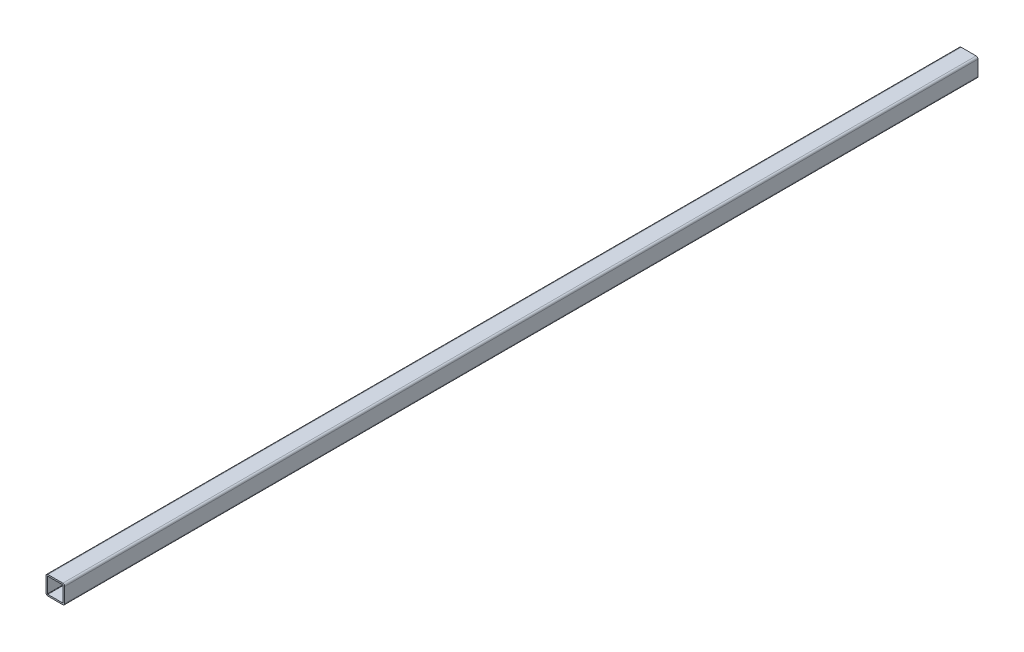
ISO-10303-21;
HEADER;
FILE_DESCRIPTION(('STEP AP214'),'2;1');
FILE_NAME('part.step','',(''),(''),'','','');
FILE_SCHEMA(('AUTOMOTIVE_DESIGN { 1 0 10303 214 1 1 1 1 }'));
ENDSEC;
DATA;
#1=APPLICATION_CONTEXT('core data for automotive mechanical design processes');
#2=APPLICATION_PROTOCOL_DEFINITION('international standard','automotive_design',2000,#1);
#3=PRODUCT_CONTEXT('',#1,'mechanical');
#4=PRODUCT('Part','Part','',(#3));
#5=PRODUCT_RELATED_PRODUCT_CATEGORY('part','',(#4));
#6=PRODUCT_DEFINITION_FORMATION('','',#4);
#7=PRODUCT_DEFINITION_CONTEXT('part definition',#1,'design');
#8=PRODUCT_DEFINITION('design','',#6,#7);
#9=PRODUCT_DEFINITION_SHAPE('','',#8);
#10=(LENGTH_UNIT() NAMED_UNIT(*) SI_UNIT(.MILLI.,.METRE.));
#11=(NAMED_UNIT(*) PLANE_ANGLE_UNIT() SI_UNIT($,.RADIAN.));
#12=(NAMED_UNIT(*) SI_UNIT($,.STERADIAN.) SOLID_ANGLE_UNIT());
#13=UNCERTAINTY_MEASURE_WITH_UNIT(LENGTH_MEASURE(1.E-05),#10,'distance_accuracy_value','');
#14=(GEOMETRIC_REPRESENTATION_CONTEXT(3) GLOBAL_UNCERTAINTY_ASSIGNED_CONTEXT((#13)) GLOBAL_UNIT_ASSIGNED_CONTEXT((#10,
#11,#12)) REPRESENTATION_CONTEXT('',''));
#15=CARTESIAN_POINT('',(0.,0.,0.));
#16=DIRECTION('',(0.,0.,1.));
#17=DIRECTION('',(1.,0.,0.));
#18=AXIS2_PLACEMENT_3D('',#15,#16,#17);
#19=CARTESIAN_POINT('',(-10.,10.,609.6));
#20=DIRECTION('',(0.,0.,1.));
#21=DIRECTION('',(1.,0.,0.));
#22=AXIS2_PLACEMENT_3D('',#19,#20,#21);
#23=PLANE('',#22);
#24=CARTESIAN_POINT('',(-10.,10.,609.6));
#25=DIRECTION('',(0.,0.,1.));
#26=DIRECTION('',(1.,0.,0.));
#27=AXIS2_PLACEMENT_3D('',#24,#25,#26);
#28=CIRCLE('',#27,2.5);
#29=CARTESIAN_POINT('',(-10.,12.5,609.6));
#30=VERTEX_POINT('',#29);
#31=CARTESIAN_POINT('',(-12.5,10.,609.6));
#32=VERTEX_POINT('',#31);
#33=EDGE_CURVE('E258',#30,#32,#28,.T.);
#34=ORIENTED_EDGE('',*,*,#33,.T.);
#35=DIRECTION('',(0.,-1.,0.));
#36=VECTOR('',#35,1.);
#37=CARTESIAN_POINT('',(-12.5,-10.,609.6));
#38=LINE('',#37,#36);
#39=CARTESIAN_POINT('',(-12.5,-10.,609.6));
#40=VERTEX_POINT('',#39);
#41=EDGE_CURVE('E261',#32,#40,#38,.T.);
#42=ORIENTED_EDGE('',*,*,#41,.T.);
#43=CARTESIAN_POINT('',(-10.,-10.,609.6));
#44=DIRECTION('',(0.,0.,1.));
#45=DIRECTION('',(-1.,0.,0.));
#46=AXIS2_PLACEMENT_3D('',#43,#44,#45);
#47=CIRCLE('',#46,2.5);
#48=CARTESIAN_POINT('',(-10.,-12.5,609.6));
#49=VERTEX_POINT('',#48);
#50=EDGE_CURVE('E264',#40,#49,#47,.T.);
#51=ORIENTED_EDGE('',*,*,#50,.T.);
#52=DIRECTION('',(1.,0.,0.));
#53=VECTOR('',#52,1.);
#54=CARTESIAN_POINT('',(10.,-12.5,609.6));
#55=LINE('',#54,#53);
#56=CARTESIAN_POINT('',(10.,-12.5,609.6));
#57=VERTEX_POINT('',#56);
#58=EDGE_CURVE('E266',#49,#57,#55,.T.);
#59=ORIENTED_EDGE('',*,*,#58,.T.);
#60=CARTESIAN_POINT('',(10.,-10.,609.6));
#61=DIRECTION('',(0.,0.,1.));
#62=DIRECTION('',(1.,0.,0.));
#63=AXIS2_PLACEMENT_3D('',#60,#61,#62);
#64=CIRCLE('',#63,2.5);
#65=CARTESIAN_POINT('',(12.5,-10.,609.6));
#66=VERTEX_POINT('',#65);
#67=EDGE_CURVE('E268',#57,#66,#64,.T.);
#68=ORIENTED_EDGE('',*,*,#67,.T.);
#69=DIRECTION('',(0.,1.,0.));
#70=VECTOR('',#69,1.);
#71=CARTESIAN_POINT('',(12.5,-10.,609.6));
#72=LINE('',#71,#70);
#73=CARTESIAN_POINT('',(12.5,10.,609.6));
#74=VERTEX_POINT('',#73);
#75=EDGE_CURVE('E270',#66,#74,#72,.T.);
#76=ORIENTED_EDGE('',*,*,#75,.T.);
#77=CARTESIAN_POINT('',(10.,10.,609.6));
#78=DIRECTION('',(0.,0.,1.));
#79=DIRECTION('',(1.,0.,0.));
#80=AXIS2_PLACEMENT_3D('',#77,#78,#79);
#81=CIRCLE('',#80,2.5);
#82=CARTESIAN_POINT('',(10.,12.5,609.6));
#83=VERTEX_POINT('',#82);
#84=EDGE_CURVE('E272',#74,#83,#81,.T.);
#85=ORIENTED_EDGE('',*,*,#84,.T.);
#86=DIRECTION('',(-1.,0.,0.));
#87=VECTOR('',#86,1.);
#88=CARTESIAN_POINT('',(10.,12.5,609.6));
#89=LINE('',#88,#87);
#90=EDGE_CURVE('E274',#83,#30,#89,.T.);
#91=ORIENTED_EDGE('',*,*,#90,.T.);
#92=EDGE_LOOP('',(#34,#42,#51,#59,#68,#76,#85,#91));
#93=FACE_BOUND('',#92,.T.);
#94=DIRECTION('',(0.,-1.,0.));
#95=VECTOR('',#94,1.);
#96=CARTESIAN_POINT('',(-10.5,-10.,609.6));
#97=LINE('',#96,#95);
#98=CARTESIAN_POINT('',(-10.5,10.,609.6));
#99=VERTEX_POINT('',#98);
#100=CARTESIAN_POINT('',(-10.5,-10.,609.6));
#101=VERTEX_POINT('',#100);
#102=EDGE_CURVE('E201',#99,#101,#97,.T.);
#103=ORIENTED_EDGE('',*,*,#102,.F.);
#104=CARTESIAN_POINT('',(-10.,10.,609.6));
#105=DIRECTION('',(0.,0.,1.));
#106=DIRECTION('',(1.,0.,0.));
#107=AXIS2_PLACEMENT_3D('',#104,#105,#106);
#108=CIRCLE('',#107,0.5);
#109=CARTESIAN_POINT('',(-10.,10.5,609.6));
#110=VERTEX_POINT('',#109);
#111=EDGE_CURVE('E193',#110,#99,#108,.T.);
#112=ORIENTED_EDGE('',*,*,#111,.F.);
#113=DIRECTION('',(-1.,0.,0.));
#114=VECTOR('',#113,1.);
#115=CARTESIAN_POINT('',(10.,10.5,609.6));
#116=LINE('',#115,#114);
#117=CARTESIAN_POINT('',(10.,10.5,609.6));
#118=VERTEX_POINT('',#117);
#119=EDGE_CURVE('E226',#118,#110,#116,.T.);
#120=ORIENTED_EDGE('',*,*,#119,.F.);
#121=CARTESIAN_POINT('',(10.,10.,609.6));
#122=DIRECTION('',(0.,0.,1.));
#123=DIRECTION('',(1.,0.,0.));
#124=AXIS2_PLACEMENT_3D('',#121,#122,#123);
#125=CIRCLE('',#124,0.499999999999997);
#126=CARTESIAN_POINT('',(10.5,10.,609.6));
#127=VERTEX_POINT('',#126);
#128=EDGE_CURVE('E224',#127,#118,#125,.T.);
#129=ORIENTED_EDGE('',*,*,#128,.F.);
#130=DIRECTION('',(0.,1.,0.));
#131=VECTOR('',#130,1.);
#132=CARTESIAN_POINT('',(10.5,-10.,609.6));
#133=LINE('',#132,#131);
#134=CARTESIAN_POINT('',(10.5,-10.,609.6));
#135=VERTEX_POINT('',#134);
#136=EDGE_CURVE('E222',#135,#127,#133,.T.);
#137=ORIENTED_EDGE('',*,*,#136,.F.);
#138=CARTESIAN_POINT('',(10.,-10.,609.6));
#139=DIRECTION('',(0.,0.,1.));
#140=DIRECTION('',(1.,0.,0.));
#141=AXIS2_PLACEMENT_3D('',#138,#139,#140);
#142=CIRCLE('',#141,0.499999999999999);
#143=CARTESIAN_POINT('',(10.,-10.5,609.6));
#144=VERTEX_POINT('',#143);
#145=EDGE_CURVE('E220',#144,#135,#142,.T.);
#146=ORIENTED_EDGE('',*,*,#145,.F.);
#147=DIRECTION('',(1.,0.,0.));
#148=VECTOR('',#147,1.);
#149=CARTESIAN_POINT('',(10.,-10.5,609.6));
#150=LINE('',#149,#148);
#151=CARTESIAN_POINT('',(-10.,-10.5,609.6));
#152=VERTEX_POINT('',#151);
#153=EDGE_CURVE('E216',#152,#144,#150,.T.);
#154=ORIENTED_EDGE('',*,*,#153,.F.);
#155=CARTESIAN_POINT('',(-10.,-10.,609.6));
#156=DIRECTION('',(0.,0.,1.));
#157=DIRECTION('',(1.,0.,0.));
#158=AXIS2_PLACEMENT_3D('',#155,#156,#157);
#159=CIRCLE('',#158,0.500000000000001);
#160=EDGE_CURVE('E214',#101,#152,#159,.T.);
#161=ORIENTED_EDGE('',*,*,#160,.F.);
#162=EDGE_LOOP('',(#103,#112,#120,#129,#137,#146,#154,#161));
#163=FACE_BOUND('',#162,.T.);
#164=ADVANCED_FACE('F80',(#93,#163),#23,.T.);
#165=CARTESIAN_POINT('',(-10.,10.,-609.6));
#166=DIRECTION('',(0.,0.,1.));
#167=DIRECTION('',(1.,0.,0.));
#168=AXIS2_PLACEMENT_3D('',#165,#166,#167);
#169=PLANE('',#168);
#170=CARTESIAN_POINT('',(-10.,10.,-609.6));
#171=DIRECTION('',(0.,0.,1.));
#172=DIRECTION('',(1.,0.,0.));
#173=AXIS2_PLACEMENT_3D('',#170,#171,#172);
#174=CIRCLE('',#173,2.5);
#175=CARTESIAN_POINT('',(-10.,12.5,-609.6));
#176=VERTEX_POINT('',#175);
#177=CARTESIAN_POINT('',(-12.5,10.,-609.6));
#178=VERTEX_POINT('',#177);
#179=EDGE_CURVE('E209',#176,#178,#174,.T.);
#180=ORIENTED_EDGE('',*,*,#179,.F.);
#181=DIRECTION('',(-1.,0.,0.));
#182=VECTOR('',#181,1.);
#183=CARTESIAN_POINT('',(10.,12.5,-609.6));
#184=LINE('',#183,#182);
#185=CARTESIAN_POINT('',(10.,12.5,-609.6));
#186=VERTEX_POINT('',#185);
#187=EDGE_CURVE('E262',#186,#176,#184,.T.);
#188=ORIENTED_EDGE('',*,*,#187,.F.);
#189=CARTESIAN_POINT('',(10.,10.,-609.6));
#190=DIRECTION('',(0.,0.,1.));
#191=DIRECTION('',(1.,0.,0.));
#192=AXIS2_PLACEMENT_3D('',#189,#190,#191);
#193=CIRCLE('',#192,2.5);
#194=CARTESIAN_POINT('',(12.5,10.,-609.6));
#195=VERTEX_POINT('',#194);
#196=EDGE_CURVE('E289',#195,#186,#193,.T.);
#197=ORIENTED_EDGE('',*,*,#196,.F.);
#198=DIRECTION('',(0.,1.,0.));
#199=VECTOR('',#198,1.);
#200=CARTESIAN_POINT('',(12.5,-10.,-609.6));
#201=LINE('',#200,#199);
#202=CARTESIAN_POINT('',(12.5,-10.,-609.6));
#203=VERTEX_POINT('',#202);
#204=EDGE_CURVE('E287',#203,#195,#201,.T.);
#205=ORIENTED_EDGE('',*,*,#204,.F.);
#206=CARTESIAN_POINT('',(10.,-10.,-609.6));
#207=DIRECTION('',(0.,0.,1.));
#208=DIRECTION('',(1.,0.,0.));
#209=AXIS2_PLACEMENT_3D('',#206,#207,#208);
#210=CIRCLE('',#209,2.5);
#211=CARTESIAN_POINT('',(10.,-12.5,-609.6));
#212=VERTEX_POINT('',#211);
#213=EDGE_CURVE('E285',#212,#203,#210,.T.);
#214=ORIENTED_EDGE('',*,*,#213,.F.);
#215=DIRECTION('',(1.,0.,0.));
#216=VECTOR('',#215,1.);
#217=CARTESIAN_POINT('',(10.,-12.5,-609.6));
#218=LINE('',#217,#216);
#219=CARTESIAN_POINT('',(-10.,-12.5,-609.6));
#220=VERTEX_POINT('',#219);
#221=EDGE_CURVE('E283',#220,#212,#218,.T.);
#222=ORIENTED_EDGE('',*,*,#221,.F.);
#223=CARTESIAN_POINT('',(-10.,-10.,-609.6));
#224=DIRECTION('',(0.,0.,1.));
#225=DIRECTION('',(-1.,0.,0.));
#226=AXIS2_PLACEMENT_3D('',#223,#224,#225);
#227=CIRCLE('',#226,2.5);
#228=CARTESIAN_POINT('',(-12.5,-10.,-609.6));
#229=VERTEX_POINT('',#228);
#230=EDGE_CURVE('E281',#229,#220,#227,.T.);
#231=ORIENTED_EDGE('',*,*,#230,.F.);
#232=DIRECTION('',(0.,-1.,0.));
#233=VECTOR('',#232,1.);
#234=CARTESIAN_POINT('',(-12.5,-10.,-609.6));
#235=LINE('',#234,#233);
#236=EDGE_CURVE('E279',#178,#229,#235,.T.);
#237=ORIENTED_EDGE('',*,*,#236,.F.);
#238=EDGE_LOOP('',(#180,#188,#197,#205,#214,#222,#231,#237));
#239=FACE_BOUND('',#238,.T.);
#240=CARTESIAN_POINT('',(-10.,10.,-609.6));
#241=DIRECTION('',(0.,0.,1.));
#242=DIRECTION('',(1.,0.,0.));
#243=AXIS2_PLACEMENT_3D('',#240,#241,#242);
#244=CIRCLE('',#243,0.5);
#245=CARTESIAN_POINT('',(-10.,10.5,-609.6));
#246=VERTEX_POINT('',#245);
#247=CARTESIAN_POINT('',(-10.5,10.,-609.6));
#248=VERTEX_POINT('',#247);
#249=EDGE_CURVE('E103',#246,#248,#244,.T.);
#250=ORIENTED_EDGE('',*,*,#249,.T.);
#251=DIRECTION('',(0.,-1.,0.));
#252=VECTOR('',#251,1.);
#253=CARTESIAN_POINT('',(-10.5,-10.,-609.6));
#254=LINE('',#253,#252);
#255=CARTESIAN_POINT('',(-10.5,-10.,-609.6));
#256=VERTEX_POINT('',#255);
#257=EDGE_CURVE('E208',#248,#256,#254,.T.);
#258=ORIENTED_EDGE('',*,*,#257,.T.);
#259=CARTESIAN_POINT('',(-10.,-10.,-609.6));
#260=DIRECTION('',(0.,0.,1.));
#261=DIRECTION('',(1.,0.,0.));
#262=AXIS2_PLACEMENT_3D('',#259,#260,#261);
#263=CIRCLE('',#262,0.500000000000001);
#264=CARTESIAN_POINT('',(-10.,-10.5,-609.6));
#265=VERTEX_POINT('',#264);
#266=EDGE_CURVE('E230',#256,#265,#263,.T.);
#267=ORIENTED_EDGE('',*,*,#266,.T.);
#268=DIRECTION('',(1.,0.,0.));
#269=VECTOR('',#268,1.);
#270=CARTESIAN_POINT('',(10.,-10.5,-609.6));
#271=LINE('',#270,#269);
#272=CARTESIAN_POINT('',(10.,-10.5,-609.6));
#273=VERTEX_POINT('',#272);
#274=EDGE_CURVE('E233',#265,#273,#271,.T.);
#275=ORIENTED_EDGE('',*,*,#274,.T.);
#276=CARTESIAN_POINT('',(10.,-10.,-609.6));
#277=DIRECTION('',(0.,0.,1.));
#278=DIRECTION('',(1.,0.,0.));
#279=AXIS2_PLACEMENT_3D('',#276,#277,#278);
#280=CIRCLE('',#279,0.499999999999999);
#281=CARTESIAN_POINT('',(10.5,-10.,-609.6));
#282=VERTEX_POINT('',#281);
#283=EDGE_CURVE('E236',#273,#282,#280,.T.);
#284=ORIENTED_EDGE('',*,*,#283,.T.);
#285=DIRECTION('',(0.,1.,0.));
#286=VECTOR('',#285,1.);
#287=CARTESIAN_POINT('',(10.5,-10.,-609.6));
#288=LINE('',#287,#286);
#289=CARTESIAN_POINT('',(10.5,10.,-609.6));
#290=VERTEX_POINT('',#289);
#291=EDGE_CURVE('E239',#282,#290,#288,.T.);
#292=ORIENTED_EDGE('',*,*,#291,.T.);
#293=CARTESIAN_POINT('',(10.,10.,-609.6));
#294=DIRECTION('',(0.,0.,1.));
#295=DIRECTION('',(1.,0.,0.));
#296=AXIS2_PLACEMENT_3D('',#293,#294,#295);
#297=CIRCLE('',#296,0.499999999999997);
#298=CARTESIAN_POINT('',(10.,10.5,-609.6));
#299=VERTEX_POINT('',#298);
#300=EDGE_CURVE('E242',#290,#299,#297,.T.);
#301=ORIENTED_EDGE('',*,*,#300,.T.);
#302=DIRECTION('',(-1.,0.,0.));
#303=VECTOR('',#302,1.);
#304=CARTESIAN_POINT('',(10.,10.5,-609.6));
#305=LINE('',#304,#303);
#306=EDGE_CURVE('E202',#299,#246,#305,.T.);
#307=ORIENTED_EDGE('',*,*,#306,.T.);
#308=EDGE_LOOP('',(#250,#258,#267,#275,#284,#292,#301,#307));
#309=FACE_BOUND('',#308,.T.);
#310=ADVANCED_FACE('F319',(#239,#309),#169,.F.);
#311=CARTESIAN_POINT('',(-10.,10.,609.6));
#312=DIRECTION('',(0.,0.,-1.));
#313=DIRECTION('',(-1.,0.,0.));
#314=AXIS2_PLACEMENT_3D('',#311,#312,#313);
#315=CYLINDRICAL_SURFACE('',#314,2.5);
#316=ORIENTED_EDGE('',*,*,#179,.T.);
#317=DIRECTION('',(0.,0.,-1.));
#318=VECTOR('',#317,1.);
#319=CARTESIAN_POINT('',(-12.5,10.,609.6));
#320=LINE('',#319,#318);
#321=EDGE_CURVE('E12',#32,#178,#320,.T.);
#322=ORIENTED_EDGE('',*,*,#321,.F.);
#323=ORIENTED_EDGE('',*,*,#33,.F.);
#324=DIRECTION('',(0.,0.,-1.));
#325=VECTOR('',#324,1.);
#326=CARTESIAN_POINT('',(-10.,12.5,609.6));
#327=LINE('',#326,#325);
#328=EDGE_CURVE('E276',#30,#176,#327,.T.);
#329=ORIENTED_EDGE('',*,*,#328,.T.);
#330=EDGE_LOOP('',(#316,#322,#323,#329));
#331=FACE_BOUND('',#330,.T.);
#332=ADVANCED_FACE('F82',(#331),#315,.T.);
#333=CARTESIAN_POINT('',(-12.5,-10.,609.6));
#334=DIRECTION('',(1.,0.,0.));
#335=DIRECTION('',(0.,0.,-1.));
#336=AXIS2_PLACEMENT_3D('',#333,#334,#335);
#337=PLANE('',#336);
#338=ORIENTED_EDGE('',*,*,#236,.T.);
#339=DIRECTION('',(0.,0.,-1.));
#340=VECTOR('',#339,1.);
#341=CARTESIAN_POINT('',(-12.5,-10.,609.6));
#342=LINE('',#341,#340);
#343=EDGE_CURVE('E88',#40,#229,#342,.T.);
#344=ORIENTED_EDGE('',*,*,#343,.F.);
#345=ORIENTED_EDGE('',*,*,#41,.F.);
#346=ORIENTED_EDGE('',*,*,#321,.T.);
#347=EDGE_LOOP('',(#338,#344,#345,#346));
#348=FACE_BOUND('',#347,.T.);
#349=ADVANCED_FACE('F336',(#348),#337,.F.);
#350=CARTESIAN_POINT('',(-10.,-10.,609.6));
#351=DIRECTION('',(0.,0.,-1.));
#352=DIRECTION('',(-1.,0.,0.));
#353=AXIS2_PLACEMENT_3D('',#350,#351,#352);
#354=CYLINDRICAL_SURFACE('',#353,2.5);
#355=ORIENTED_EDGE('',*,*,#230,.T.);
#356=DIRECTION('',(0.,0.,-1.));
#357=VECTOR('',#356,1.);
#358=CARTESIAN_POINT('',(-10.,-12.5,609.6));
#359=LINE('',#358,#357);
#360=EDGE_CURVE('E306',#49,#220,#359,.T.);
#361=ORIENTED_EDGE('',*,*,#360,.F.);
#362=ORIENTED_EDGE('',*,*,#50,.F.);
#363=ORIENTED_EDGE('',*,*,#343,.T.);
#364=EDGE_LOOP('',(#355,#361,#362,#363));
#365=FACE_BOUND('',#364,.T.);
#366=ADVANCED_FACE('F313',(#365),#354,.T.);
#367=CARTESIAN_POINT('',(10.,-12.5,609.6));
#368=DIRECTION('',(0.,1.,0.));
#369=DIRECTION('',(-1.,0.,0.));
#370=AXIS2_PLACEMENT_3D('',#367,#368,#369);
#371=PLANE('',#370);
#372=ORIENTED_EDGE('',*,*,#221,.T.);
#373=DIRECTION('',(0.,0.,-1.));
#374=VECTOR('',#373,1.);
#375=CARTESIAN_POINT('',(10.,-12.5,609.6));
#376=LINE('',#375,#374);
#377=EDGE_CURVE('E303',#57,#212,#376,.T.);
#378=ORIENTED_EDGE('',*,*,#377,.F.);
#379=ORIENTED_EDGE('',*,*,#58,.F.);
#380=ORIENTED_EDGE('',*,*,#360,.T.);
#381=EDGE_LOOP('',(#372,#378,#379,#380));
#382=FACE_BOUND('',#381,.T.);
#383=ADVANCED_FACE('F325',(#382),#371,.F.);
#384=CARTESIAN_POINT('',(10.,-10.,609.6));
#385=DIRECTION('',(0.,0.,-1.));
#386=DIRECTION('',(-1.,0.,0.));
#387=AXIS2_PLACEMENT_3D('',#384,#385,#386);
#388=CYLINDRICAL_SURFACE('',#387,2.5);
#389=ORIENTED_EDGE('',*,*,#213,.T.);
#390=DIRECTION('',(0.,0.,-1.));
#391=VECTOR('',#390,1.);
#392=CARTESIAN_POINT('',(12.5,-10.,609.6));
#393=LINE('',#392,#391);
#394=EDGE_CURVE('E300',#66,#203,#393,.T.);
#395=ORIENTED_EDGE('',*,*,#394,.F.);
#396=ORIENTED_EDGE('',*,*,#67,.F.);
#397=ORIENTED_EDGE('',*,*,#377,.T.);
#398=EDGE_LOOP('',(#389,#395,#396,#397));
#399=FACE_BOUND('',#398,.T.);
#400=ADVANCED_FACE('F329',(#399),#388,.T.);
#401=CARTESIAN_POINT('',(12.5,-10.,609.6));
#402=DIRECTION('',(-1.,0.,0.));
#403=DIRECTION('',(0.,-1.,0.));
#404=AXIS2_PLACEMENT_3D('',#401,#402,#403);
#405=PLANE('',#404);
#406=ORIENTED_EDGE('',*,*,#204,.T.);
#407=DIRECTION('',(0.,0.,-1.));
#408=VECTOR('',#407,1.);
#409=CARTESIAN_POINT('',(12.5,10.,609.6));
#410=LINE('',#409,#408);
#411=EDGE_CURVE('E297',#74,#195,#410,.T.);
#412=ORIENTED_EDGE('',*,*,#411,.F.);
#413=ORIENTED_EDGE('',*,*,#75,.F.);
#414=ORIENTED_EDGE('',*,*,#394,.T.);
#415=EDGE_LOOP('',(#406,#412,#413,#414));
#416=FACE_BOUND('',#415,.T.);
#417=ADVANCED_FACE('F349',(#416),#405,.F.);
#418=CARTESIAN_POINT('',(10.,10.,609.6));
#419=DIRECTION('',(0.,0.,-1.));
#420=DIRECTION('',(-1.,0.,0.));
#421=AXIS2_PLACEMENT_3D('',#418,#419,#420);
#422=CYLINDRICAL_SURFACE('',#421,2.5);
#423=ORIENTED_EDGE('',*,*,#196,.T.);
#424=DIRECTION('',(0.,0.,-1.));
#425=VECTOR('',#424,1.);
#426=CARTESIAN_POINT('',(10.,12.5,609.6));
#427=LINE('',#426,#425);
#428=EDGE_CURVE('E294',#83,#186,#427,.T.);
#429=ORIENTED_EDGE('',*,*,#428,.F.);
#430=ORIENTED_EDGE('',*,*,#84,.F.);
#431=ORIENTED_EDGE('',*,*,#411,.T.);
#432=EDGE_LOOP('',(#423,#429,#430,#431));
#433=FACE_BOUND('',#432,.T.);
#434=ADVANCED_FACE('F347',(#433),#422,.T.);
#435=CARTESIAN_POINT('',(10.,12.5,609.6));
#436=DIRECTION('',(0.,-1.,0.));
#437=DIRECTION('',(1.,0.,0.));
#438=AXIS2_PLACEMENT_3D('',#435,#436,#437);
#439=PLANE('',#438);
#440=ORIENTED_EDGE('',*,*,#187,.T.);
#441=ORIENTED_EDGE('',*,*,#328,.F.);
#442=ORIENTED_EDGE('',*,*,#90,.F.);
#443=ORIENTED_EDGE('',*,*,#428,.T.);
#444=EDGE_LOOP('',(#440,#441,#442,#443));
#445=FACE_BOUND('',#444,.T.);
#446=ADVANCED_FACE('F342',(#445),#439,.F.);
#447=CARTESIAN_POINT('',(-10.,10.,609.6));
#448=DIRECTION('',(0.,0.,-1.));
#449=DIRECTION('',(-1.,0.,0.));
#450=AXIS2_PLACEMENT_3D('',#447,#448,#449);
#451=CYLINDRICAL_SURFACE('',#450,0.5);
#452=ORIENTED_EDGE('',*,*,#249,.F.);
#453=DIRECTION('',(0.,0.,-1.));
#454=VECTOR('',#453,1.);
#455=CARTESIAN_POINT('',(-10.,10.5,609.6));
#456=LINE('',#455,#454);
#457=EDGE_CURVE('E197',#110,#246,#456,.T.);
#458=ORIENTED_EDGE('',*,*,#457,.F.);
#459=ORIENTED_EDGE('',*,*,#111,.T.);
#460=DIRECTION('',(0.,0.,-1.));
#461=VECTOR('',#460,1.);
#462=CARTESIAN_POINT('',(-10.5,10.,609.6));
#463=LINE('',#462,#461);
#464=EDGE_CURVE('E196',#99,#248,#463,.T.);
#465=ORIENTED_EDGE('',*,*,#464,.T.);
#466=EDGE_LOOP('',(#452,#458,#459,#465));
#467=FACE_BOUND('',#466,.T.);
#468=ADVANCED_FACE('F195',(#467),#451,.F.);
#469=CARTESIAN_POINT('',(-10.5,-10.,609.6));
#470=DIRECTION('',(1.,0.,0.));
#471=DIRECTION('',(0.,0.,-1.));
#472=AXIS2_PLACEMENT_3D('',#469,#470,#471);
#473=PLANE('',#472);
#474=ORIENTED_EDGE('',*,*,#257,.F.);
#475=ORIENTED_EDGE('',*,*,#464,.F.);
#476=ORIENTED_EDGE('',*,*,#102,.T.);
#477=DIRECTION('',(0.,0.,-1.));
#478=VECTOR('',#477,1.);
#479=CARTESIAN_POINT('',(-10.5,-10.,609.6));
#480=LINE('',#479,#478);
#481=EDGE_CURVE('E210',#101,#256,#480,.T.);
#482=ORIENTED_EDGE('',*,*,#481,.T.);
#483=EDGE_LOOP('',(#474,#475,#476,#482));
#484=FACE_BOUND('',#483,.T.);
#485=ADVANCED_FACE('F205',(#484),#473,.T.);
#486=CARTESIAN_POINT('',(-10.,-10.,609.6));
#487=DIRECTION('',(0.,0.,-1.));
#488=DIRECTION('',(-1.,0.,0.));
#489=AXIS2_PLACEMENT_3D('',#486,#487,#488);
#490=CYLINDRICAL_SURFACE('',#489,0.500000000000001);
#491=ORIENTED_EDGE('',*,*,#266,.F.);
#492=ORIENTED_EDGE('',*,*,#481,.F.);
#493=ORIENTED_EDGE('',*,*,#160,.T.);
#494=DIRECTION('',(0.,0.,-1.));
#495=VECTOR('',#494,1.);
#496=CARTESIAN_POINT('',(-10.,-10.5,609.6));
#497=LINE('',#496,#495);
#498=EDGE_CURVE('E255',#152,#265,#497,.T.);
#499=ORIENTED_EDGE('',*,*,#498,.T.);
#500=EDGE_LOOP('',(#491,#492,#493,#499));
#501=FACE_BOUND('',#500,.T.);
#502=ADVANCED_FACE('F374',(#501),#490,.F.);
#503=CARTESIAN_POINT('',(10.,-10.5,609.6));
#504=DIRECTION('',(0.,1.,0.));
#505=DIRECTION('',(-1.,0.,0.));
#506=AXIS2_PLACEMENT_3D('',#503,#504,#505);
#507=PLANE('',#506);
#508=ORIENTED_EDGE('',*,*,#274,.F.);
#509=ORIENTED_EDGE('',*,*,#498,.F.);
#510=ORIENTED_EDGE('',*,*,#153,.T.);
#511=DIRECTION('',(0.,0.,-1.));
#512=VECTOR('',#511,1.);
#513=CARTESIAN_POINT('',(10.,-10.5,609.6));
#514=LINE('',#513,#512);
#515=EDGE_CURVE('E253',#144,#273,#514,.T.);
#516=ORIENTED_EDGE('',*,*,#515,.T.);
#517=EDGE_LOOP('',(#508,#509,#510,#516));
#518=FACE_BOUND('',#517,.T.);
#519=ADVANCED_FACE('F378',(#518),#507,.T.);
#520=CARTESIAN_POINT('',(10.,-10.,609.6));
#521=DIRECTION('',(0.,0.,-1.));
#522=DIRECTION('',(-1.,0.,0.));
#523=AXIS2_PLACEMENT_3D('',#520,#521,#522);
#524=CYLINDRICAL_SURFACE('',#523,0.499999999999999);
#525=ORIENTED_EDGE('',*,*,#283,.F.);
#526=ORIENTED_EDGE('',*,*,#515,.F.);
#527=ORIENTED_EDGE('',*,*,#145,.T.);
#528=DIRECTION('',(0.,0.,-1.));
#529=VECTOR('',#528,1.);
#530=CARTESIAN_POINT('',(10.5,-10.,609.6));
#531=LINE('',#530,#529);
#532=EDGE_CURVE('E251',#135,#282,#531,.T.);
#533=ORIENTED_EDGE('',*,*,#532,.T.);
#534=EDGE_LOOP('',(#525,#526,#527,#533));
#535=FACE_BOUND('',#534,.T.);
#536=ADVANCED_FACE('F384',(#535),#524,.F.);
#537=CARTESIAN_POINT('',(10.5,-10.,609.6));
#538=DIRECTION('',(-1.,0.,0.));
#539=DIRECTION('',(0.,-1.,0.));
#540=AXIS2_PLACEMENT_3D('',#537,#538,#539);
#541=PLANE('',#540);
#542=ORIENTED_EDGE('',*,*,#291,.F.);
#543=ORIENTED_EDGE('',*,*,#532,.F.);
#544=ORIENTED_EDGE('',*,*,#136,.T.);
#545=DIRECTION('',(0.,0.,-1.));
#546=VECTOR('',#545,1.);
#547=CARTESIAN_POINT('',(10.5,10.,609.6));
#548=LINE('',#547,#546);
#549=EDGE_CURVE('E249',#127,#290,#548,.T.);
#550=ORIENTED_EDGE('',*,*,#549,.T.);
#551=EDGE_LOOP('',(#542,#543,#544,#550));
#552=FACE_BOUND('',#551,.T.);
#553=ADVANCED_FACE('F388',(#552),#541,.T.);
#554=CARTESIAN_POINT('',(10.,10.,609.6));
#555=DIRECTION('',(0.,0.,-1.));
#556=DIRECTION('',(-1.,0.,0.));
#557=AXIS2_PLACEMENT_3D('',#554,#555,#556);
#558=CYLINDRICAL_SURFACE('',#557,0.499999999999997);
#559=ORIENTED_EDGE('',*,*,#300,.F.);
#560=ORIENTED_EDGE('',*,*,#549,.F.);
#561=ORIENTED_EDGE('',*,*,#128,.T.);
#562=DIRECTION('',(0.,0.,-1.));
#563=VECTOR('',#562,1.);
#564=CARTESIAN_POINT('',(10.,10.5,609.6));
#565=LINE('',#564,#563);
#566=EDGE_CURVE('E95',#118,#299,#565,.T.);
#567=ORIENTED_EDGE('',*,*,#566,.T.);
#568=EDGE_LOOP('',(#559,#560,#561,#567));
#569=FACE_BOUND('',#568,.T.);
#570=ADVANCED_FACE('F392',(#569),#558,.F.);
#571=CARTESIAN_POINT('',(10.,10.5,609.6));
#572=DIRECTION('',(0.,-1.,0.));
#573=DIRECTION('',(1.,0.,0.));
#574=AXIS2_PLACEMENT_3D('',#571,#572,#573);
#575=PLANE('',#574);
#576=ORIENTED_EDGE('',*,*,#306,.F.);
#577=ORIENTED_EDGE('',*,*,#566,.F.);
#578=ORIENTED_EDGE('',*,*,#119,.T.);
#579=ORIENTED_EDGE('',*,*,#457,.T.);
#580=EDGE_LOOP('',(#576,#577,#578,#579));
#581=FACE_BOUND('',#580,.T.);
#582=ADVANCED_FACE('F396',(#581),#575,.T.);
#583=CLOSED_SHELL('',(#164,#310,#332,#349,#366,#383,#400,#417,#434,#446,#468,#485,#502,#519,
#536,#553,#570,#582));
#584=MANIFOLD_SOLID_BREP('B2',#583);
#585=ADVANCED_BREP_SHAPE_REPRESENTATION('',(#18,#584),#14);
#586=SHAPE_DEFINITION_REPRESENTATION(#9,#585);
ENDSEC;
END-ISO-10303-21;
